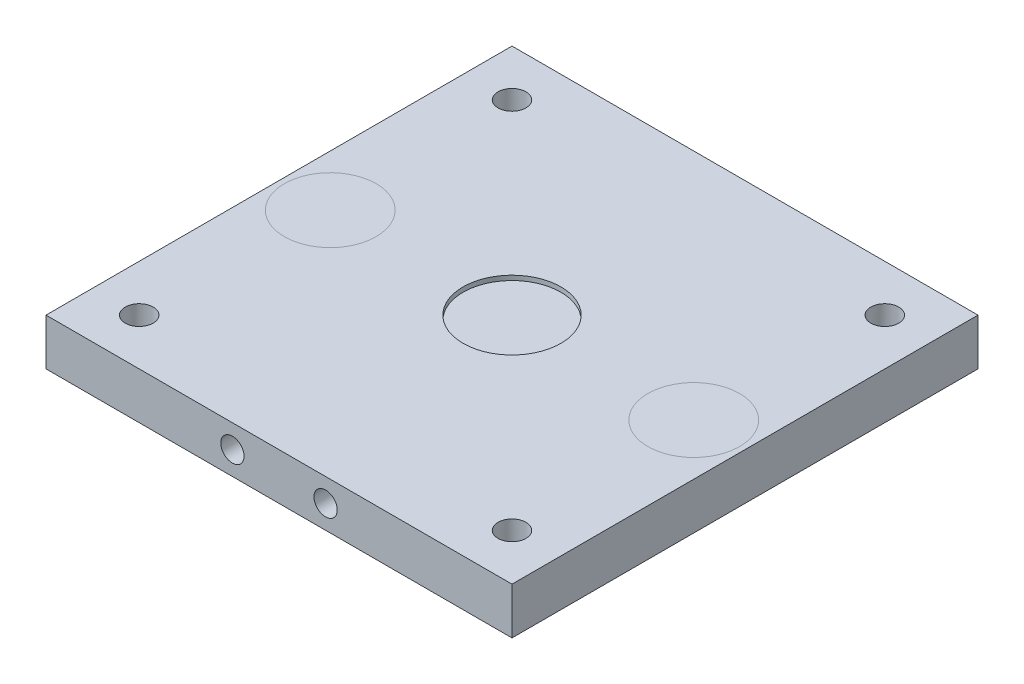
ISO-10303-21;
HEADER;
FILE_DESCRIPTION(('STEP AP214'),'2;1');
FILE_NAME('part.step','',(''),(''),'','','');
FILE_SCHEMA(('AUTOMOTIVE_DESIGN { 1 0 10303 214 1 1 1 1 }'));
ENDSEC;
DATA;
#1=APPLICATION_CONTEXT('core data for automotive mechanical design processes');
#2=APPLICATION_PROTOCOL_DEFINITION('international standard','automotive_design',2000,#1);
#3=PRODUCT_CONTEXT('',#1,'mechanical');
#4=PRODUCT('Part','Part','',(#3));
#5=PRODUCT_RELATED_PRODUCT_CATEGORY('part','',(#4));
#6=PRODUCT_DEFINITION_FORMATION('','',#4);
#7=PRODUCT_DEFINITION_CONTEXT('part definition',#1,'design');
#8=PRODUCT_DEFINITION('design','',#6,#7);
#9=PRODUCT_DEFINITION_SHAPE('','',#8);
#10=(LENGTH_UNIT() NAMED_UNIT(*) SI_UNIT(.MILLI.,.METRE.));
#11=(NAMED_UNIT(*) PLANE_ANGLE_UNIT() SI_UNIT($,.RADIAN.));
#12=(NAMED_UNIT(*) SI_UNIT($,.STERADIAN.) SOLID_ANGLE_UNIT());
#13=UNCERTAINTY_MEASURE_WITH_UNIT(LENGTH_MEASURE(1.E-05),#10,'distance_accuracy_value','');
#14=(GEOMETRIC_REPRESENTATION_CONTEXT(3) GLOBAL_UNCERTAINTY_ASSIGNED_CONTEXT((#13)) GLOBAL_UNIT_ASSIGNED_CONTEXT((#10,
#11,#12)) REPRESENTATION_CONTEXT('',''));
#15=CARTESIAN_POINT('',(0.,0.,0.));
#16=DIRECTION('',(0.,0.,1.));
#17=DIRECTION('',(1.,0.,0.));
#18=AXIS2_PLACEMENT_3D('',#15,#16,#17);
#19=CARTESIAN_POINT('',(0.,10.,0.));
#20=DIRECTION('',(0.,-1.,0.));
#21=DIRECTION('',(0.,0.,-1.));
#22=AXIS2_PLACEMENT_3D('',#19,#20,#21);
#23=PLANE('',#22);
#24=CARTESIAN_POINT('',(40.,10.,40.));
#25=DIRECTION('',(0.,-1.,0.));
#26=DIRECTION('',(0.,0.,-1.));
#27=AXIS2_PLACEMENT_3D('',#24,#25,#26);
#28=CIRCLE('',#27,3.);
#29=CARTESIAN_POINT('',(40.,10.,37.));
#30=VERTEX_POINT('',#29);
#31=EDGE_CURVE('E200',#30,#30,#28,.F.);
#32=ORIENTED_EDGE('',*,*,#31,.F.);
#33=EDGE_LOOP('',(#32));
#34=FACE_BOUND('',#33,.T.);
#35=CARTESIAN_POINT('',(-40.,10.,-40.));
#36=DIRECTION('',(0.,-1.,0.));
#37=DIRECTION('',(0.,0.,-1.));
#38=AXIS2_PLACEMENT_3D('',#35,#36,#37);
#39=CIRCLE('',#38,3.);
#40=CARTESIAN_POINT('',(-40.,10.,-43.));
#41=VERTEX_POINT('',#40);
#42=EDGE_CURVE('E201',#41,#41,#39,.F.);
#43=ORIENTED_EDGE('',*,*,#42,.F.);
#44=EDGE_LOOP('',(#43));
#45=FACE_BOUND('',#44,.T.);
#46=CARTESIAN_POINT('',(40.,10.,-40.));
#47=DIRECTION('',(0.,-1.,0.));
#48=DIRECTION('',(0.,0.,-1.));
#49=AXIS2_PLACEMENT_3D('',#46,#47,#48);
#50=CIRCLE('',#49,3.);
#51=CARTESIAN_POINT('',(40.,10.,-43.));
#52=VERTEX_POINT('',#51);
#53=EDGE_CURVE('E193',#52,#52,#50,.F.);
#54=ORIENTED_EDGE('',*,*,#53,.F.);
#55=EDGE_LOOP('',(#54));
#56=FACE_BOUND('',#55,.T.);
#57=CARTESIAN_POINT('',(-40.,10.,40.));
#58=DIRECTION('',(0.,-1.,0.));
#59=DIRECTION('',(0.,0.,-1.));
#60=AXIS2_PLACEMENT_3D('',#57,#58,#59);
#61=CIRCLE('',#60,3.);
#62=CARTESIAN_POINT('',(-40.,10.,37.));
#63=VERTEX_POINT('',#62);
#64=EDGE_CURVE('E211',#63,#63,#61,.F.);
#65=ORIENTED_EDGE('',*,*,#64,.F.);
#66=EDGE_LOOP('',(#65));
#67=FACE_BOUND('',#66,.T.);
#68=CARTESIAN_POINT('',(0.,10.,0.));
#69=DIRECTION('',(0.,1.,0.));
#70=DIRECTION('',(0.,0.,1.));
#71=AXIS2_PLACEMENT_3D('',#68,#69,#70);
#72=CIRCLE('',#71,10.5);
#73=CARTESIAN_POINT('',(0.,10.,10.5));
#74=VERTEX_POINT('',#73);
#75=EDGE_CURVE('E214',#74,#74,#72,.T.);
#76=ORIENTED_EDGE('',*,*,#75,.F.);
#77=EDGE_LOOP('',(#76));
#78=FACE_BOUND('',#77,.T.);
#79=DIRECTION('',(0.,0.,1.));
#80=VECTOR('',#79,1.);
#81=CARTESIAN_POINT('',(-50.,10.,-50.));
#82=LINE('',#81,#80);
#83=CARTESIAN_POINT('',(-50.,10.,-50.));
#84=VERTEX_POINT('',#83);
#85=CARTESIAN_POINT('',(-50.,10.,50.));
#86=VERTEX_POINT('',#85);
#87=EDGE_CURVE('E97',#84,#86,#82,.T.);
#88=ORIENTED_EDGE('',*,*,#87,.T.);
#89=DIRECTION('',(1.,0.,0.));
#90=VECTOR('',#89,1.);
#91=CARTESIAN_POINT('',(50.,10.,50.));
#92=LINE('',#91,#90);
#93=CARTESIAN_POINT('',(50.,10.,50.));
#94=VERTEX_POINT('',#93);
#95=EDGE_CURVE('E92',#86,#94,#92,.T.);
#96=ORIENTED_EDGE('',*,*,#95,.T.);
#97=DIRECTION('',(0.,0.,-1.));
#98=VECTOR('',#97,1.);
#99=CARTESIAN_POINT('',(50.,10.,-50.));
#100=LINE('',#99,#98);
#101=CARTESIAN_POINT('',(50.,10.,-50.));
#102=VERTEX_POINT('',#101);
#103=EDGE_CURVE('E95',#94,#102,#100,.T.);
#104=ORIENTED_EDGE('',*,*,#103,.T.);
#105=DIRECTION('',(-1.,0.,0.));
#106=VECTOR('',#105,1.);
#107=CARTESIAN_POINT('',(50.,10.,-50.));
#108=LINE('',#107,#106);
#109=EDGE_CURVE('E61',#102,#84,#108,.T.);
#110=ORIENTED_EDGE('',*,*,#109,.T.);
#111=EDGE_LOOP('',(#88,#96,#104,#110));
#112=FACE_BOUND('',#111,.T.);
#113=CARTESIAN_POINT('',(39.,10.,0.));
#114=DIRECTION('',(0.,-1.,0.));
#115=DIRECTION('',(0.,0.,-1.));
#116=AXIS2_PLACEMENT_3D('',#113,#114,#115);
#117=CIRCLE('',#116,9.85);
#118=CARTESIAN_POINT('',(39.,10.,-9.85000000000001));
#119=VERTEX_POINT('',#118);
#120=EDGE_CURVE('E53',#119,#119,#117,.F.);
#121=ORIENTED_EDGE('',*,*,#120,.F.);
#122=EDGE_LOOP('',(#121));
#123=FACE_BOUND('',#122,.T.);
#124=CARTESIAN_POINT('',(-39.,10.,0.));
#125=DIRECTION('',(0.,-1.,0.));
#126=DIRECTION('',(0.,0.,-1.));
#127=AXIS2_PLACEMENT_3D('',#124,#125,#126);
#128=CIRCLE('',#127,9.85);
#129=CARTESIAN_POINT('',(-39.,10.,-9.84999999999999));
#130=VERTEX_POINT('',#129);
#131=EDGE_CURVE('E11',#130,#130,#128,.F.);
#132=ORIENTED_EDGE('',*,*,#131,.F.);
#133=EDGE_LOOP('',(#132));
#134=FACE_BOUND('',#133,.T.);
#135=ADVANCED_FACE('F43',(#34,#45,#56,#67,#78,#112,#123,#134),#23,.F.);
#136=ORIENTED_EDGE('',*,*,#131,.T.);
#137=EDGE_LOOP('',(#136));
#138=FACE_BOUND('',#137,.T.);
#139=ADVANCED_FACE('F130',(#138),#23,.F.);
#140=CARTESIAN_POINT('',(-50.,10.,-50.));
#141=DIRECTION('',(1.,0.,0.));
#142=DIRECTION('',(0.,0.,-1.));
#143=AXIS2_PLACEMENT_3D('',#140,#141,#142);
#144=PLANE('',#143);
#145=DIRECTION('',(0.,0.,1.));
#146=VECTOR('',#145,1.);
#147=CARTESIAN_POINT('',(-50.,0.,-50.));
#148=LINE('',#147,#146);
#149=CARTESIAN_POINT('',(-50.,0.,-50.));
#150=VERTEX_POINT('',#149);
#151=CARTESIAN_POINT('',(-50.,0.,50.));
#152=VERTEX_POINT('',#151);
#153=EDGE_CURVE('E112',#150,#152,#148,.T.);
#154=ORIENTED_EDGE('',*,*,#153,.T.);
#155=DIRECTION('',(0.,-1.,0.));
#156=VECTOR('',#155,1.);
#157=CARTESIAN_POINT('',(-50.,10.,50.));
#158=LINE('',#157,#156);
#159=EDGE_CURVE('E103',#86,#152,#158,.T.);
#160=ORIENTED_EDGE('',*,*,#159,.F.);
#161=ORIENTED_EDGE('',*,*,#87,.F.);
#162=DIRECTION('',(0.,-1.,0.));
#163=VECTOR('',#162,1.);
#164=CARTESIAN_POINT('',(-50.,10.,-50.));
#165=LINE('',#164,#163);
#166=EDGE_CURVE('E108',#84,#150,#165,.T.);
#167=ORIENTED_EDGE('',*,*,#166,.T.);
#168=EDGE_LOOP('',(#154,#160,#161,#167));
#169=FACE_BOUND('',#168,.T.);
#170=ADVANCED_FACE('F45',(#169),#144,.F.);
#171=CARTESIAN_POINT('',(50.,10.,50.));
#172=DIRECTION('',(0.,0.,-1.));
#173=DIRECTION('',(-1.,0.,0.));
#174=AXIS2_PLACEMENT_3D('',#171,#172,#173);
#175=PLANE('',#174);
#176=CARTESIAN_POINT('',(9.99999999999999,5.00000000000001,50.));
#177=DIRECTION('',(0.,0.,-1.));
#178=DIRECTION('',(-1.,0.,0.));
#179=AXIS2_PLACEMENT_3D('',#176,#177,#178);
#180=CIRCLE('',#179,2.5);
#181=CARTESIAN_POINT('',(7.49999999999999,5.00000000000001,50.));
#182=VERTEX_POINT('',#181);
#183=EDGE_CURVE('E166',#182,#182,#180,.T.);
#184=ORIENTED_EDGE('',*,*,#183,.T.);
#185=EDGE_LOOP('',(#184));
#186=FACE_BOUND('',#185,.T.);
#187=CARTESIAN_POINT('',(-10.,5.00000000000001,50.));
#188=DIRECTION('',(0.,0.,-1.));
#189=DIRECTION('',(-1.,0.,0.));
#190=AXIS2_PLACEMENT_3D('',#187,#188,#189);
#191=CIRCLE('',#190,2.5);
#192=CARTESIAN_POINT('',(-12.5,5.00000000000001,50.));
#193=VERTEX_POINT('',#192);
#194=EDGE_CURVE('E169',#193,#193,#191,.T.);
#195=ORIENTED_EDGE('',*,*,#194,.T.);
#196=EDGE_LOOP('',(#195));
#197=FACE_BOUND('',#196,.T.);
#198=DIRECTION('',(1.,0.,0.));
#199=VECTOR('',#198,1.);
#200=CARTESIAN_POINT('',(50.,0.,50.));
#201=LINE('',#200,#199);
#202=CARTESIAN_POINT('',(50.,0.,50.));
#203=VERTEX_POINT('',#202);
#204=EDGE_CURVE('E102',#152,#203,#201,.T.);
#205=ORIENTED_EDGE('',*,*,#204,.T.);
#206=DIRECTION('',(0.,-1.,0.));
#207=VECTOR('',#206,1.);
#208=CARTESIAN_POINT('',(50.,10.,50.));
#209=LINE('',#208,#207);
#210=EDGE_CURVE('E100',#94,#203,#209,.T.);
#211=ORIENTED_EDGE('',*,*,#210,.F.);
#212=ORIENTED_EDGE('',*,*,#95,.F.);
#213=ORIENTED_EDGE('',*,*,#159,.T.);
#214=EDGE_LOOP('',(#205,#211,#212,#213));
#215=FACE_BOUND('',#214,.T.);
#216=ADVANCED_FACE('F101',(#186,#197,#215),#175,.F.);
#217=CARTESIAN_POINT('',(50.,10.,-50.));
#218=DIRECTION('',(-1.,0.,0.));
#219=DIRECTION('',(0.,0.,1.));
#220=AXIS2_PLACEMENT_3D('',#217,#218,#219);
#221=PLANE('',#220);
#222=DIRECTION('',(0.,0.,-1.));
#223=VECTOR('',#222,1.);
#224=CARTESIAN_POINT('',(50.,0.,-50.));
#225=LINE('',#224,#223);
#226=CARTESIAN_POINT('',(50.,0.,-50.));
#227=VERTEX_POINT('',#226);
#228=EDGE_CURVE('E78',#203,#227,#225,.T.);
#229=ORIENTED_EDGE('',*,*,#228,.T.);
#230=DIRECTION('',(0.,-1.,0.));
#231=VECTOR('',#230,1.);
#232=CARTESIAN_POINT('',(50.,10.,-50.));
#233=LINE('',#232,#231);
#234=EDGE_CURVE('E104',#102,#227,#233,.T.);
#235=ORIENTED_EDGE('',*,*,#234,.F.);
#236=ORIENTED_EDGE('',*,*,#103,.F.);
#237=ORIENTED_EDGE('',*,*,#210,.T.);
#238=EDGE_LOOP('',(#229,#235,#236,#237));
#239=FACE_BOUND('',#238,.T.);
#240=ADVANCED_FACE('F106',(#239),#221,.F.);
#241=CARTESIAN_POINT('',(50.,10.,-50.));
#242=DIRECTION('',(0.,0.,1.));
#243=DIRECTION('',(1.,0.,0.));
#244=AXIS2_PLACEMENT_3D('',#241,#242,#243);
#245=PLANE('',#244);
#246=CARTESIAN_POINT('',(9.99999999999999,5.00000000000001,-50.));
#247=DIRECTION('',(0.,0.,-1.));
#248=DIRECTION('',(-1.,0.,0.));
#249=AXIS2_PLACEMENT_3D('',#246,#247,#248);
#250=CIRCLE('',#249,2.5);
#251=CARTESIAN_POINT('',(7.49999999999999,5.00000000000001,-50.));
#252=VERTEX_POINT('',#251);
#253=EDGE_CURVE('E181',#252,#252,#250,.T.);
#254=ORIENTED_EDGE('',*,*,#253,.F.);
#255=EDGE_LOOP('',(#254));
#256=FACE_BOUND('',#255,.T.);
#257=CARTESIAN_POINT('',(-10.,5.00000000000001,-50.));
#258=DIRECTION('',(0.,0.,-1.));
#259=DIRECTION('',(-1.,0.,0.));
#260=AXIS2_PLACEMENT_3D('',#257,#258,#259);
#261=CIRCLE('',#260,2.5);
#262=CARTESIAN_POINT('',(-12.5,5.00000000000001,-50.));
#263=VERTEX_POINT('',#262);
#264=EDGE_CURVE('E187',#263,#263,#261,.T.);
#265=ORIENTED_EDGE('',*,*,#264,.F.);
#266=EDGE_LOOP('',(#265));
#267=FACE_BOUND('',#266,.T.);
#268=DIRECTION('',(-1.,0.,0.));
#269=VECTOR('',#268,1.);
#270=CARTESIAN_POINT('',(50.,0.,-50.));
#271=LINE('',#270,#269);
#272=EDGE_CURVE('E84',#227,#150,#271,.T.);
#273=ORIENTED_EDGE('',*,*,#272,.T.);
#274=ORIENTED_EDGE('',*,*,#166,.F.);
#275=ORIENTED_EDGE('',*,*,#109,.F.);
#276=ORIENTED_EDGE('',*,*,#234,.T.);
#277=EDGE_LOOP('',(#273,#274,#275,#276));
#278=FACE_BOUND('',#277,.T.);
#279=ADVANCED_FACE('F144',(#256,#267,#278),#245,.F.);
#280=ORIENTED_EDGE('',*,*,#120,.T.);
#281=EDGE_LOOP('',(#280));
#282=FACE_BOUND('',#281,.T.);
#283=ADVANCED_FACE('F127',(#282),#23,.F.);
#284=CARTESIAN_POINT('',(0.,0.,0.));
#285=DIRECTION('',(0.,-1.,0.));
#286=DIRECTION('',(0.,0.,-1.));
#287=AXIS2_PLACEMENT_3D('',#284,#285,#286);
#288=PLANE('',#287);
#289=CARTESIAN_POINT('',(40.,0.,40.));
#290=DIRECTION('',(0.,-1.,0.));
#291=DIRECTION('',(0.,0.,-1.));
#292=AXIS2_PLACEMENT_3D('',#289,#290,#291);
#293=CIRCLE('',#292,3.);
#294=CARTESIAN_POINT('',(40.,0.,37.));
#295=VERTEX_POINT('',#294);
#296=EDGE_CURVE('E197',#295,#295,#293,.T.);
#297=ORIENTED_EDGE('',*,*,#296,.F.);
#298=EDGE_LOOP('',(#297));
#299=FACE_BOUND('',#298,.T.);
#300=CARTESIAN_POINT('',(-40.,0.,-40.));
#301=DIRECTION('',(0.,-1.,0.));
#302=DIRECTION('',(0.,0.,-1.));
#303=AXIS2_PLACEMENT_3D('',#300,#301,#302);
#304=CIRCLE('',#303,3.);
#305=CARTESIAN_POINT('',(-40.,0.,-43.));
#306=VERTEX_POINT('',#305);
#307=EDGE_CURVE('E196',#306,#306,#304,.T.);
#308=ORIENTED_EDGE('',*,*,#307,.F.);
#309=EDGE_LOOP('',(#308));
#310=FACE_BOUND('',#309,.T.);
#311=CARTESIAN_POINT('',(40.,0.,-40.));
#312=DIRECTION('',(0.,-1.,0.));
#313=DIRECTION('',(0.,0.,-1.));
#314=AXIS2_PLACEMENT_3D('',#311,#312,#313);
#315=CIRCLE('',#314,3.);
#316=CARTESIAN_POINT('',(40.,0.,-43.));
#317=VERTEX_POINT('',#316);
#318=EDGE_CURVE('E180',#317,#317,#315,.T.);
#319=ORIENTED_EDGE('',*,*,#318,.F.);
#320=EDGE_LOOP('',(#319));
#321=FACE_BOUND('',#320,.T.);
#322=CARTESIAN_POINT('',(-40.,0.,40.));
#323=DIRECTION('',(0.,-1.,0.));
#324=DIRECTION('',(0.,0.,-1.));
#325=AXIS2_PLACEMENT_3D('',#322,#323,#324);
#326=CIRCLE('',#325,3.);
#327=CARTESIAN_POINT('',(-40.,0.,37.));
#328=VERTEX_POINT('',#327);
#329=EDGE_CURVE('E204',#328,#328,#326,.T.);
#330=ORIENTED_EDGE('',*,*,#329,.F.);
#331=EDGE_LOOP('',(#330));
#332=FACE_BOUND('',#331,.T.);
#333=ORIENTED_EDGE('',*,*,#153,.F.);
#334=ORIENTED_EDGE('',*,*,#272,.F.);
#335=ORIENTED_EDGE('',*,*,#228,.F.);
#336=ORIENTED_EDGE('',*,*,#204,.F.);
#337=EDGE_LOOP('',(#333,#334,#335,#336));
#338=FACE_BOUND('',#337,.T.);
#339=ADVANCED_FACE('F143',(#299,#310,#321,#332,#338),#288,.T.);
#340=CARTESIAN_POINT('',(0.,9.,0.));
#341=DIRECTION('',(0.,1.,0.));
#342=DIRECTION('',(0.,0.,1.));
#343=AXIS2_PLACEMENT_3D('',#340,#341,#342);
#344=CYLINDRICAL_SURFACE('',#343,10.5);
#345=CARTESIAN_POINT('',(0.,9.,0.));
#346=DIRECTION('',(0.,1.,0.));
#347=DIRECTION('',(0.,0.,1.));
#348=AXIS2_PLACEMENT_3D('',#345,#346,#347);
#349=CIRCLE('',#348,10.5);
#350=CARTESIAN_POINT('',(0.,9.,10.5));
#351=VERTEX_POINT('',#350);
#352=EDGE_CURVE('E115',#351,#351,#349,.T.);
#353=ORIENTED_EDGE('',*,*,#352,.F.);
#354=EDGE_LOOP('',(#353));
#355=FACE_BOUND('',#354,.T.);
#356=ORIENTED_EDGE('',*,*,#75,.T.);
#357=EDGE_LOOP('',(#356));
#358=FACE_BOUND('',#357,.T.);
#359=ADVANCED_FACE('F149',(#355,#358),#344,.F.);
#360=CARTESIAN_POINT('',(0.,9.,0.));
#361=DIRECTION('',(0.,1.,0.));
#362=DIRECTION('',(0.,0.,1.));
#363=AXIS2_PLACEMENT_3D('',#360,#361,#362);
#364=PLANE('',#363);
#365=ORIENTED_EDGE('',*,*,#352,.T.);
#366=EDGE_LOOP('',(#365));
#367=FACE_BOUND('',#366,.T.);
#368=ADVANCED_FACE('F222',(#367),#364,.T.);
#369=CARTESIAN_POINT('',(-40.,10.001,40.));
#370=DIRECTION('',(0.,-1.,0.));
#371=DIRECTION('',(0.,0.,-1.));
#372=AXIS2_PLACEMENT_3D('',#369,#370,#371);
#373=CYLINDRICAL_SURFACE('',#372,3.);
#374=ORIENTED_EDGE('',*,*,#329,.T.);
#375=EDGE_LOOP('',(#374));
#376=FACE_BOUND('',#375,.T.);
#377=ORIENTED_EDGE('',*,*,#64,.T.);
#378=EDGE_LOOP('',(#377));
#379=FACE_BOUND('',#378,.T.);
#380=ADVANCED_FACE('F227',(#376,#379),#373,.F.);
#381=CARTESIAN_POINT('',(40.,10.001,-40.));
#382=DIRECTION('',(0.,-1.,0.));
#383=DIRECTION('',(0.,0.,-1.));
#384=AXIS2_PLACEMENT_3D('',#381,#382,#383);
#385=CYLINDRICAL_SURFACE('',#384,3.);
#386=ORIENTED_EDGE('',*,*,#318,.T.);
#387=EDGE_LOOP('',(#386));
#388=FACE_BOUND('',#387,.T.);
#389=ORIENTED_EDGE('',*,*,#53,.T.);
#390=EDGE_LOOP('',(#389));
#391=FACE_BOUND('',#390,.T.);
#392=ADVANCED_FACE('F234',(#388,#391),#385,.F.);
#393=CARTESIAN_POINT('',(-40.,10.001,-40.));
#394=DIRECTION('',(0.,-1.,0.));
#395=DIRECTION('',(0.,0.,-1.));
#396=AXIS2_PLACEMENT_3D('',#393,#394,#395);
#397=CYLINDRICAL_SURFACE('',#396,3.);
#398=ORIENTED_EDGE('',*,*,#307,.T.);
#399=EDGE_LOOP('',(#398));
#400=FACE_BOUND('',#399,.T.);
#401=ORIENTED_EDGE('',*,*,#42,.T.);
#402=EDGE_LOOP('',(#401));
#403=FACE_BOUND('',#402,.T.);
#404=ADVANCED_FACE('F236',(#400,#403),#397,.F.);
#405=CARTESIAN_POINT('',(40.,10.001,40.));
#406=DIRECTION('',(0.,-1.,0.));
#407=DIRECTION('',(0.,0.,-1.));
#408=AXIS2_PLACEMENT_3D('',#405,#406,#407);
#409=CYLINDRICAL_SURFACE('',#408,3.);
#410=ORIENTED_EDGE('',*,*,#296,.T.);
#411=EDGE_LOOP('',(#410));
#412=FACE_BOUND('',#411,.T.);
#413=ORIENTED_EDGE('',*,*,#31,.T.);
#414=EDGE_LOOP('',(#413));
#415=FACE_BOUND('',#414,.T.);
#416=ADVANCED_FACE('F239',(#412,#415),#409,.F.);
#417=CARTESIAN_POINT('',(-10.,5.00000000000001,-40.));
#418=DIRECTION('',(0.,0.,-1.));
#419=DIRECTION('',(-1.,0.,0.));
#420=AXIS2_PLACEMENT_3D('',#417,#418,#419);
#421=CYLINDRICAL_SURFACE('',#420,2.5);
#422=CARTESIAN_POINT('',(-10.,5.00000000000001,-40.));
#423=DIRECTION('',(0.,0.,-1.));
#424=DIRECTION('',(-1.,0.,0.));
#425=AXIS2_PLACEMENT_3D('',#422,#423,#424);
#426=CIRCLE('',#425,2.5);
#427=CARTESIAN_POINT('',(-12.5,5.00000000000001,-40.));
#428=VERTEX_POINT('',#427);
#429=EDGE_CURVE('E184',#428,#428,#426,.T.);
#430=ORIENTED_EDGE('',*,*,#429,.F.);
#431=EDGE_LOOP('',(#430));
#432=FACE_BOUND('',#431,.T.);
#433=ORIENTED_EDGE('',*,*,#264,.T.);
#434=EDGE_LOOP('',(#433));
#435=FACE_BOUND('',#434,.T.);
#436=ADVANCED_FACE('F243',(#432,#435),#421,.F.);
#437=CARTESIAN_POINT('',(-10.,5.00000000000001,-40.));
#438=DIRECTION('',(0.,0.,-1.));
#439=DIRECTION('',(-1.,0.,0.));
#440=AXIS2_PLACEMENT_3D('',#437,#438,#439);
#441=PLANE('',#440);
#442=ORIENTED_EDGE('',*,*,#429,.T.);
#443=EDGE_LOOP('',(#442));
#444=FACE_BOUND('',#443,.T.);
#445=ADVANCED_FACE('F250',(#444),#441,.T.);
#446=CARTESIAN_POINT('',(9.99999999999999,5.00000000000001,-40.));
#447=DIRECTION('',(0.,0.,-1.));
#448=DIRECTION('',(-1.,0.,0.));
#449=AXIS2_PLACEMENT_3D('',#446,#447,#448);
#450=CYLINDRICAL_SURFACE('',#449,2.5);
#451=CARTESIAN_POINT('',(9.99999999999999,5.00000000000001,-40.));
#452=DIRECTION('',(0.,0.,-1.));
#453=DIRECTION('',(-1.,0.,0.));
#454=AXIS2_PLACEMENT_3D('',#451,#452,#453);
#455=CIRCLE('',#454,2.5);
#456=CARTESIAN_POINT('',(7.49999999999999,5.00000000000001,-40.));
#457=VERTEX_POINT('',#456);
#458=EDGE_CURVE('E177',#457,#457,#455,.T.);
#459=ORIENTED_EDGE('',*,*,#458,.F.);
#460=EDGE_LOOP('',(#459));
#461=FACE_BOUND('',#460,.T.);
#462=ORIENTED_EDGE('',*,*,#253,.T.);
#463=EDGE_LOOP('',(#462));
#464=FACE_BOUND('',#463,.T.);
#465=ADVANCED_FACE('F254',(#461,#464),#450,.F.);
#466=CARTESIAN_POINT('',(9.99999999999999,5.00000000000001,-40.));
#467=DIRECTION('',(0.,0.,-1.));
#468=DIRECTION('',(-1.,0.,0.));
#469=AXIS2_PLACEMENT_3D('',#466,#467,#468);
#470=PLANE('',#469);
#471=ORIENTED_EDGE('',*,*,#458,.T.);
#472=EDGE_LOOP('',(#471));
#473=FACE_BOUND('',#472,.T.);
#474=ADVANCED_FACE('F258',(#473),#470,.T.);
#475=CARTESIAN_POINT('',(-10.,5.00000000000001,40.));
#476=DIRECTION('',(0.,0.,1.));
#477=DIRECTION('',(1.,0.,0.));
#478=AXIS2_PLACEMENT_3D('',#475,#476,#477);
#479=CYLINDRICAL_SURFACE('',#478,2.5);
#480=CARTESIAN_POINT('',(-10.,5.00000000000001,40.));
#481=DIRECTION('',(0.,0.,-1.));
#482=DIRECTION('',(-1.,0.,0.));
#483=AXIS2_PLACEMENT_3D('',#480,#481,#482);
#484=CIRCLE('',#483,2.5);
#485=CARTESIAN_POINT('',(-12.5,5.00000000000001,40.));
#486=VERTEX_POINT('',#485);
#487=EDGE_CURVE('E171',#486,#486,#484,.T.);
#488=ORIENTED_EDGE('',*,*,#487,.T.);
#489=EDGE_LOOP('',(#488));
#490=FACE_BOUND('',#489,.T.);
#491=ORIENTED_EDGE('',*,*,#194,.F.);
#492=EDGE_LOOP('',(#491));
#493=FACE_BOUND('',#492,.T.);
#494=ADVANCED_FACE('F262',(#490,#493),#479,.F.);
#495=CARTESIAN_POINT('',(-10.,5.00000000000001,40.));
#496=DIRECTION('',(0.,0.,1.));
#497=DIRECTION('',(-1.,0.,0.));
#498=AXIS2_PLACEMENT_3D('',#495,#496,#497);
#499=PLANE('',#498);
#500=ORIENTED_EDGE('',*,*,#487,.F.);
#501=EDGE_LOOP('',(#500));
#502=FACE_BOUND('',#501,.T.);
#503=ADVANCED_FACE('F266',(#502),#499,.T.);
#504=CARTESIAN_POINT('',(9.99999999999999,5.00000000000001,40.));
#505=DIRECTION('',(0.,0.,1.));
#506=DIRECTION('',(1.,0.,0.));
#507=AXIS2_PLACEMENT_3D('',#504,#505,#506);
#508=CYLINDRICAL_SURFACE('',#507,2.5);
#509=CARTESIAN_POINT('',(9.99999999999999,5.00000000000001,40.));
#510=DIRECTION('',(0.,0.,-1.));
#511=DIRECTION('',(-1.,0.,0.));
#512=AXIS2_PLACEMENT_3D('',#509,#510,#511);
#513=CIRCLE('',#512,2.5);
#514=CARTESIAN_POINT('',(7.49999999999999,5.00000000000001,40.));
#515=VERTEX_POINT('',#514);
#516=EDGE_CURVE('E190',#515,#515,#513,.T.);
#517=ORIENTED_EDGE('',*,*,#516,.T.);
#518=EDGE_LOOP('',(#517));
#519=FACE_BOUND('',#518,.T.);
#520=ORIENTED_EDGE('',*,*,#183,.F.);
#521=EDGE_LOOP('',(#520));
#522=FACE_BOUND('',#521,.T.);
#523=ADVANCED_FACE('F270',(#519,#522),#508,.F.);
#524=CARTESIAN_POINT('',(9.99999999999999,5.00000000000001,40.));
#525=DIRECTION('',(0.,0.,1.));
#526=DIRECTION('',(-1.,0.,0.));
#527=AXIS2_PLACEMENT_3D('',#524,#525,#526);
#528=PLANE('',#527);
#529=ORIENTED_EDGE('',*,*,#516,.F.);
#530=EDGE_LOOP('',(#529));
#531=FACE_BOUND('',#530,.T.);
#532=ADVANCED_FACE('F274',(#531),#528,.T.);
#533=CLOSED_SHELL('',(#135,#139,#170,#216,#240,#279,#283,#339,#359,#368,#380,#392,#404,#416,
#436,#445,#465,#474,#494,#503,#523,#532));
#534=MANIFOLD_SOLID_BREP('B2',#533);
#535=ADVANCED_BREP_SHAPE_REPRESENTATION('',(#18,#534),#14);
#536=SHAPE_DEFINITION_REPRESENTATION(#9,#535);
ENDSEC;
END-ISO-10303-21;
